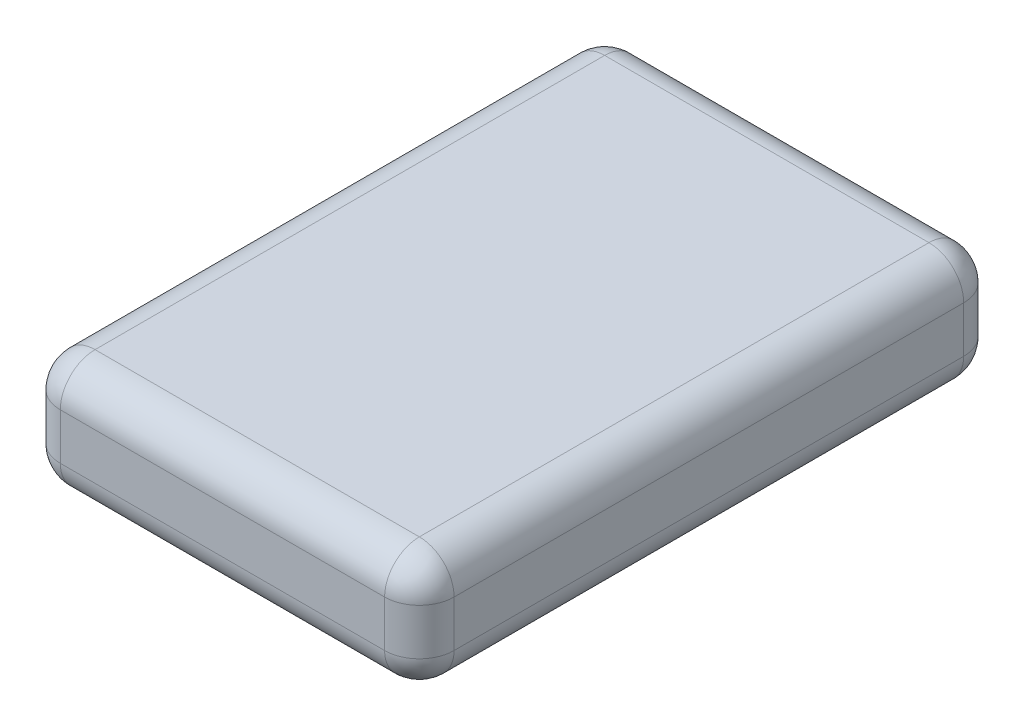
ISO-10303-21;
HEADER;
FILE_DESCRIPTION(('STEP AP214'),'2;1');
FILE_NAME('part.step','',(''),(''),'','','');
FILE_SCHEMA(('AUTOMOTIVE_DESIGN { 1 0 10303 214 1 1 1 1 }'));
ENDSEC;
DATA;
#1=APPLICATION_CONTEXT('core data for automotive mechanical design processes');
#2=APPLICATION_PROTOCOL_DEFINITION('international standard','automotive_design',2000,#1);
#3=PRODUCT_CONTEXT('',#1,'mechanical');
#4=PRODUCT('Part','Part','',(#3));
#5=PRODUCT_RELATED_PRODUCT_CATEGORY('part','',(#4));
#6=PRODUCT_DEFINITION_FORMATION('','',#4);
#7=PRODUCT_DEFINITION_CONTEXT('part definition',#1,'design');
#8=PRODUCT_DEFINITION('design','',#6,#7);
#9=PRODUCT_DEFINITION_SHAPE('','',#8);
#10=(LENGTH_UNIT() NAMED_UNIT(*) SI_UNIT(.MILLI.,.METRE.));
#11=(NAMED_UNIT(*) PLANE_ANGLE_UNIT() SI_UNIT($,.RADIAN.));
#12=(NAMED_UNIT(*) SI_UNIT($,.STERADIAN.) SOLID_ANGLE_UNIT());
#13=UNCERTAINTY_MEASURE_WITH_UNIT(LENGTH_MEASURE(1.E-05),#10,'distance_accuracy_value','');
#14=(GEOMETRIC_REPRESENTATION_CONTEXT(3) GLOBAL_UNCERTAINTY_ASSIGNED_CONTEXT((#13)) GLOBAL_UNIT_ASSIGNED_CONTEXT((#10,
#11,#12)) REPRESENTATION_CONTEXT('',''));
#15=CARTESIAN_POINT('',(0.,0.,0.));
#16=DIRECTION('',(0.,0.,1.));
#17=DIRECTION('',(1.,0.,0.));
#18=AXIS2_PLACEMENT_3D('',#15,#16,#17);
#19=CARTESIAN_POINT('',(17.,10.,-25.));
#20=DIRECTION('',(-1.,0.,0.));
#21=DIRECTION('',(0.,0.,1.));
#22=AXIS2_PLACEMENT_3D('',#19,#20,#21);
#23=PLANE('',#22);
#24=DIRECTION('',(0.,0.,-1.));
#25=VECTOR('',#24,1.);
#26=CARTESIAN_POINT('',(17.,7.,25.));
#27=LINE('',#26,#25);
#28=CARTESIAN_POINT('',(17.,7.,-22.));
#29=VERTEX_POINT('',#28);
#30=CARTESIAN_POINT('',(17.,7.,22.));
#31=VERTEX_POINT('',#30);
#32=EDGE_CURVE('E236',#29,#31,#27,.F.);
#33=ORIENTED_EDGE('',*,*,#32,.T.);
#34=DIRECTION('',(0.,-1.,0.));
#35=VECTOR('',#34,1.);
#36=CARTESIAN_POINT('',(17.,10.,22.));
#37=LINE('',#36,#35);
#38=CARTESIAN_POINT('',(17.,3.,22.));
#39=VERTEX_POINT('',#38);
#40=EDGE_CURVE('E254',#31,#39,#37,.T.);
#41=ORIENTED_EDGE('',*,*,#40,.T.);
#42=DIRECTION('',(0.,0.,-1.));
#43=VECTOR('',#42,1.);
#44=CARTESIAN_POINT('',(17.,3.,-25.));
#45=LINE('',#44,#43);
#46=CARTESIAN_POINT('',(17.,3.,-22.));
#47=VERTEX_POINT('',#46);
#48=EDGE_CURVE('E241',#39,#47,#45,.T.);
#49=ORIENTED_EDGE('',*,*,#48,.T.);
#50=DIRECTION('',(0.,-1.,0.));
#51=VECTOR('',#50,1.);
#52=CARTESIAN_POINT('',(17.,10.,-22.));
#53=LINE('',#52,#51);
#54=EDGE_CURVE('E247',#47,#29,#53,.F.);
#55=ORIENTED_EDGE('',*,*,#54,.T.);
#56=EDGE_LOOP('',(#33,#41,#49,#55));
#57=FACE_BOUND('',#56,.T.);
#58=ADVANCED_FACE('F37',(#57),#23,.F.);
#59=CARTESIAN_POINT('',(-17.,10.,-25.));
#60=DIRECTION('',(0.,0.,1.));
#61=DIRECTION('',(1.,0.,0.));
#62=AXIS2_PLACEMENT_3D('',#59,#60,#61);
#63=PLANE('',#62);
#64=DIRECTION('',(-1.,0.,0.));
#65=VECTOR('',#64,1.);
#66=CARTESIAN_POINT('',(14.,7.,-25.));
#67=LINE('',#66,#65);
#68=CARTESIAN_POINT('',(-14.,7.,-25.));
#69=VERTEX_POINT('',#68);
#70=CARTESIAN_POINT('',(14.,7.,-25.));
#71=VERTEX_POINT('',#70);
#72=EDGE_CURVE('E218',#69,#71,#67,.F.);
#73=ORIENTED_EDGE('',*,*,#72,.T.);
#74=DIRECTION('',(0.,-1.,0.));
#75=VECTOR('',#74,1.);
#76=CARTESIAN_POINT('',(14.,10.,-25.));
#77=LINE('',#76,#75);
#78=CARTESIAN_POINT('',(14.,3.,-25.));
#79=VERTEX_POINT('',#78);
#80=EDGE_CURVE('E220',#71,#79,#77,.T.);
#81=ORIENTED_EDGE('',*,*,#80,.T.);
#82=DIRECTION('',(-1.,0.,0.));
#83=VECTOR('',#82,1.);
#84=CARTESIAN_POINT('',(-17.,3.,-25.));
#85=LINE('',#84,#83);
#86=CARTESIAN_POINT('',(-14.,3.,-25.));
#87=VERTEX_POINT('',#86);
#88=EDGE_CURVE('E62',#79,#87,#85,.T.);
#89=ORIENTED_EDGE('',*,*,#88,.T.);
#90=DIRECTION('',(0.,-1.,0.));
#91=VECTOR('',#90,1.);
#92=CARTESIAN_POINT('',(-14.,10.,-25.));
#93=LINE('',#92,#91);
#94=EDGE_CURVE('E215',#87,#69,#93,.F.);
#95=ORIENTED_EDGE('',*,*,#94,.T.);
#96=EDGE_LOOP('',(#73,#81,#89,#95));
#97=FACE_BOUND('',#96,.T.);
#98=ADVANCED_FACE('F244',(#97),#63,.F.);
#99=CARTESIAN_POINT('',(-17.,10.,-25.));
#100=DIRECTION('',(1.,0.,0.));
#101=DIRECTION('',(0.,0.,-1.));
#102=AXIS2_PLACEMENT_3D('',#99,#100,#101);
#103=PLANE('',#102);
#104=DIRECTION('',(0.,0.,1.));
#105=VECTOR('',#104,1.);
#106=CARTESIAN_POINT('',(-17.,3.,-25.));
#107=LINE('',#106,#105);
#108=CARTESIAN_POINT('',(-17.,3.,-22.));
#109=VERTEX_POINT('',#108);
#110=CARTESIAN_POINT('',(-17.,3.,22.));
#111=VERTEX_POINT('',#110);
#112=EDGE_CURVE('E137',#109,#111,#107,.T.);
#113=ORIENTED_EDGE('',*,*,#112,.T.);
#114=DIRECTION('',(0.,-1.,0.));
#115=VECTOR('',#114,1.);
#116=CARTESIAN_POINT('',(-17.,10.,22.));
#117=LINE('',#116,#115);
#118=CARTESIAN_POINT('',(-17.,7.,22.));
#119=VERTEX_POINT('',#118);
#120=EDGE_CURVE('E131',#111,#119,#117,.F.);
#121=ORIENTED_EDGE('',*,*,#120,.T.);
#122=DIRECTION('',(0.,0.,1.));
#123=VECTOR('',#122,1.);
#124=CARTESIAN_POINT('',(-17.,7.,-25.));
#125=LINE('',#124,#123);
#126=CARTESIAN_POINT('',(-17.,7.,-22.));
#127=VERTEX_POINT('',#126);
#128=EDGE_CURVE('E134',#119,#127,#125,.F.);
#129=ORIENTED_EDGE('',*,*,#128,.T.);
#130=DIRECTION('',(0.,-1.,0.));
#131=VECTOR('',#130,1.);
#132=CARTESIAN_POINT('',(-17.,10.,-22.));
#133=LINE('',#132,#131);
#134=EDGE_CURVE('E142',#127,#109,#133,.T.);
#135=ORIENTED_EDGE('',*,*,#134,.T.);
#136=EDGE_LOOP('',(#113,#121,#129,#135));
#137=FACE_BOUND('',#136,.T.);
#138=ADVANCED_FACE('F133',(#137),#103,.F.);
#139=CARTESIAN_POINT('',(-17.,10.,25.));
#140=DIRECTION('',(0.,0.,-1.));
#141=DIRECTION('',(-1.,0.,0.));
#142=AXIS2_PLACEMENT_3D('',#139,#140,#141);
#143=PLANE('',#142);
#144=DIRECTION('',(1.,0.,0.));
#145=VECTOR('',#144,1.);
#146=CARTESIAN_POINT('',(-14.,7.,25.));
#147=LINE('',#146,#145);
#148=CARTESIAN_POINT('',(14.,7.,25.));
#149=VERTEX_POINT('',#148);
#150=CARTESIAN_POINT('',(-14.,7.,25.));
#151=VERTEX_POINT('',#150);
#152=EDGE_CURVE('E162',#149,#151,#147,.F.);
#153=ORIENTED_EDGE('',*,*,#152,.T.);
#154=DIRECTION('',(0.,-1.,0.));
#155=VECTOR('',#154,1.);
#156=CARTESIAN_POINT('',(-14.,10.,25.));
#157=LINE('',#156,#155);
#158=CARTESIAN_POINT('',(-14.,3.,25.));
#159=VERTEX_POINT('',#158);
#160=EDGE_CURVE('E167',#151,#159,#157,.T.);
#161=ORIENTED_EDGE('',*,*,#160,.T.);
#162=DIRECTION('',(1.,0.,0.));
#163=VECTOR('',#162,1.);
#164=CARTESIAN_POINT('',(-17.,3.,25.));
#165=LINE('',#164,#163);
#166=CARTESIAN_POINT('',(14.,3.,25.));
#167=VERTEX_POINT('',#166);
#168=EDGE_CURVE('E271',#159,#167,#165,.T.);
#169=ORIENTED_EDGE('',*,*,#168,.T.);
#170=DIRECTION('',(0.,-1.,0.));
#171=VECTOR('',#170,1.);
#172=CARTESIAN_POINT('',(14.,10.,25.));
#173=LINE('',#172,#171);
#174=EDGE_CURVE('E273',#167,#149,#173,.F.);
#175=ORIENTED_EDGE('',*,*,#174,.T.);
#176=EDGE_LOOP('',(#153,#161,#169,#175));
#177=FACE_BOUND('',#176,.T.);
#178=ADVANCED_FACE('F327',(#177),#143,.F.);
#179=CARTESIAN_POINT('',(0.,10.,0.));
#180=DIRECTION('',(0.,1.,0.));
#181=DIRECTION('',(0.,0.,1.));
#182=AXIS2_PLACEMENT_3D('',#179,#180,#181);
#183=PLANE('',#182);
#184=DIRECTION('',(0.,0.,1.));
#185=VECTOR('',#184,1.);
#186=CARTESIAN_POINT('',(-14.,10.,25.));
#187=LINE('',#186,#185);
#188=CARTESIAN_POINT('',(-14.,10.,-22.));
#189=VERTEX_POINT('',#188);
#190=CARTESIAN_POINT('',(-14.,10.,22.));
#191=VERTEX_POINT('',#190);
#192=EDGE_CURVE('E230',#189,#191,#187,.T.);
#193=ORIENTED_EDGE('',*,*,#192,.T.);
#194=DIRECTION('',(1.,0.,0.));
#195=VECTOR('',#194,1.);
#196=CARTESIAN_POINT('',(14.,10.,22.));
#197=LINE('',#196,#195);
#198=CARTESIAN_POINT('',(14.,10.,22.));
#199=VERTEX_POINT('',#198);
#200=EDGE_CURVE('E11',#191,#199,#197,.T.);
#201=ORIENTED_EDGE('',*,*,#200,.T.);
#202=DIRECTION('',(0.,0.,-1.));
#203=VECTOR('',#202,1.);
#204=CARTESIAN_POINT('',(14.,10.,-25.));
#205=LINE('',#204,#203);
#206=CARTESIAN_POINT('',(14.,10.,-22.));
#207=VERTEX_POINT('',#206);
#208=EDGE_CURVE('E232',#199,#207,#205,.T.);
#209=ORIENTED_EDGE('',*,*,#208,.T.);
#210=DIRECTION('',(-1.,0.,0.));
#211=VECTOR('',#210,1.);
#212=CARTESIAN_POINT('',(-14.,10.,-22.));
#213=LINE('',#212,#211);
#214=EDGE_CURVE('E46',#207,#189,#213,.T.);
#215=ORIENTED_EDGE('',*,*,#214,.T.);
#216=EDGE_LOOP('',(#193,#201,#209,#215));
#217=FACE_BOUND('',#216,.T.);
#218=ADVANCED_FACE('F229',(#217),#183,.T.);
#219=CARTESIAN_POINT('',(0.,0.,0.));
#220=DIRECTION('',(0.,1.,0.));
#221=DIRECTION('',(0.,0.,1.));
#222=AXIS2_PLACEMENT_3D('',#219,#220,#221);
#223=PLANE('',#222);
#224=DIRECTION('',(0.,0.,-1.));
#225=VECTOR('',#224,1.);
#226=CARTESIAN_POINT('',(14.,0.,0.));
#227=LINE('',#226,#225);
#228=CARTESIAN_POINT('',(14.,0.,-22.));
#229=VERTEX_POINT('',#228);
#230=CARTESIAN_POINT('',(14.,0.,22.));
#231=VERTEX_POINT('',#230);
#232=EDGE_CURVE('E284',#229,#231,#227,.F.);
#233=ORIENTED_EDGE('',*,*,#232,.T.);
#234=DIRECTION('',(1.,0.,0.));
#235=VECTOR('',#234,1.);
#236=CARTESIAN_POINT('',(0.,0.,22.));
#237=LINE('',#236,#235);
#238=CARTESIAN_POINT('',(-14.,0.,22.));
#239=VERTEX_POINT('',#238);
#240=EDGE_CURVE('E263',#231,#239,#237,.F.);
#241=ORIENTED_EDGE('',*,*,#240,.T.);
#242=DIRECTION('',(0.,0.,1.));
#243=VECTOR('',#242,1.);
#244=CARTESIAN_POINT('',(-14.,0.,0.));
#245=LINE('',#244,#243);
#246=CARTESIAN_POINT('',(-14.,0.,-22.));
#247=VERTEX_POINT('',#246);
#248=EDGE_CURVE('E281',#239,#247,#245,.F.);
#249=ORIENTED_EDGE('',*,*,#248,.T.);
#250=DIRECTION('',(-1.,0.,0.));
#251=VECTOR('',#250,1.);
#252=CARTESIAN_POINT('',(0.,0.,-22.));
#253=LINE('',#252,#251);
#254=EDGE_CURVE('E209',#247,#229,#253,.F.);
#255=ORIENTED_EDGE('',*,*,#254,.T.);
#256=EDGE_LOOP('',(#233,#241,#249,#255));
#257=FACE_BOUND('',#256,.T.);
#258=ADVANCED_FACE('F290',(#257),#223,.F.);
#259=CARTESIAN_POINT('',(-14.,3.,-25.));
#260=DIRECTION('',(0.,0.,1.));
#261=DIRECTION('',(1.,0.,0.));
#262=AXIS2_PLACEMENT_3D('',#259,#260,#261);
#263=CYLINDRICAL_SURFACE('',#262,3.);
#264=ORIENTED_EDGE('',*,*,#248,.F.);
#265=CARTESIAN_POINT('',(-14.,3.,22.));
#266=DIRECTION('',(0.,0.,1.));
#267=DIRECTION('',(1.,0.,0.));
#268=AXIS2_PLACEMENT_3D('',#265,#266,#267);
#269=CIRCLE('',#268,3.);
#270=EDGE_CURVE('E266',#239,#111,#269,.F.);
#271=ORIENTED_EDGE('',*,*,#270,.T.);
#272=ORIENTED_EDGE('',*,*,#112,.F.);
#273=CARTESIAN_POINT('',(-14.,3.,-22.));
#274=DIRECTION('',(0.,0.,1.));
#275=DIRECTION('',(1.,0.,0.));
#276=AXIS2_PLACEMENT_3D('',#273,#274,#275);
#277=CIRCLE('',#276,3.);
#278=EDGE_CURVE('E141',#109,#247,#277,.T.);
#279=ORIENTED_EDGE('',*,*,#278,.T.);
#280=EDGE_LOOP('',(#264,#271,#272,#279));
#281=FACE_BOUND('',#280,.T.);
#282=ADVANCED_FACE('F307',(#281),#263,.T.);
#283=CARTESIAN_POINT('',(-14.,7.,0.));
#284=DIRECTION('',(0.,0.,-1.));
#285=DIRECTION('',(-1.,0.,0.));
#286=AXIS2_PLACEMENT_3D('',#283,#284,#285);
#287=CYLINDRICAL_SURFACE('',#286,3.);
#288=ORIENTED_EDGE('',*,*,#128,.F.);
#289=CARTESIAN_POINT('',(-14.,7.,22.));
#290=DIRECTION('',(0.,0.,-1.));
#291=DIRECTION('',(-1.,0.,0.));
#292=AXIS2_PLACEMENT_3D('',#289,#290,#291);
#293=CIRCLE('',#292,3.);
#294=EDGE_CURVE('E149',#119,#191,#293,.T.);
#295=ORIENTED_EDGE('',*,*,#294,.T.);
#296=ORIENTED_EDGE('',*,*,#192,.F.);
#297=CARTESIAN_POINT('',(-14.,7.,-22.));
#298=DIRECTION('',(0.,0.,-1.));
#299=DIRECTION('',(-1.,0.,0.));
#300=AXIS2_PLACEMENT_3D('',#297,#298,#299);
#301=CIRCLE('',#300,3.);
#302=EDGE_CURVE('E152',#189,#127,#301,.F.);
#303=ORIENTED_EDGE('',*,*,#302,.T.);
#304=EDGE_LOOP('',(#288,#295,#296,#303));
#305=FACE_BOUND('',#304,.T.);
#306=ADVANCED_FACE('F147',(#305),#287,.T.);
#307=CARTESIAN_POINT('',(14.,3.,-25.));
#308=DIRECTION('',(0.,0.,-1.));
#309=DIRECTION('',(-1.,0.,0.));
#310=AXIS2_PLACEMENT_3D('',#307,#308,#309);
#311=CYLINDRICAL_SURFACE('',#310,3.);
#312=ORIENTED_EDGE('',*,*,#48,.F.);
#313=CARTESIAN_POINT('',(14.,3.,22.));
#314=DIRECTION('',(0.,0.,-1.));
#315=DIRECTION('',(-1.,0.,0.));
#316=AXIS2_PLACEMENT_3D('',#313,#314,#315);
#317=CIRCLE('',#316,3.);
#318=EDGE_CURVE('E259',#39,#231,#317,.T.);
#319=ORIENTED_EDGE('',*,*,#318,.T.);
#320=ORIENTED_EDGE('',*,*,#232,.F.);
#321=CARTESIAN_POINT('',(14.,3.,-22.));
#322=DIRECTION('',(0.,0.,-1.));
#323=DIRECTION('',(-1.,0.,0.));
#324=AXIS2_PLACEMENT_3D('',#321,#322,#323);
#325=CIRCLE('',#324,3.);
#326=EDGE_CURVE('E261',#229,#47,#325,.F.);
#327=ORIENTED_EDGE('',*,*,#326,.T.);
#328=EDGE_LOOP('',(#312,#319,#320,#327));
#329=FACE_BOUND('',#328,.T.);
#330=ADVANCED_FACE('F314',(#329),#311,.T.);
#331=CARTESIAN_POINT('',(14.,7.,0.));
#332=DIRECTION('',(0.,0.,1.));
#333=DIRECTION('',(1.,0.,0.));
#334=AXIS2_PLACEMENT_3D('',#331,#332,#333);
#335=CYLINDRICAL_SURFACE('',#334,3.);
#336=ORIENTED_EDGE('',*,*,#208,.F.);
#337=CARTESIAN_POINT('',(14.,7.,22.));
#338=DIRECTION('',(0.,0.,1.));
#339=DIRECTION('',(1.,0.,0.));
#340=AXIS2_PLACEMENT_3D('',#337,#338,#339);
#341=CIRCLE('',#340,3.);
#342=EDGE_CURVE('E222',#199,#31,#341,.F.);
#343=ORIENTED_EDGE('',*,*,#342,.T.);
#344=ORIENTED_EDGE('',*,*,#32,.F.);
#345=CARTESIAN_POINT('',(14.,7.,-22.));
#346=DIRECTION('',(0.,0.,1.));
#347=DIRECTION('',(1.,0.,0.));
#348=AXIS2_PLACEMENT_3D('',#345,#346,#347);
#349=CIRCLE('',#348,3.);
#350=EDGE_CURVE('E251',#29,#207,#349,.T.);
#351=ORIENTED_EDGE('',*,*,#350,.T.);
#352=EDGE_LOOP('',(#336,#343,#344,#351));
#353=FACE_BOUND('',#352,.T.);
#354=ADVANCED_FACE('F467',(#353),#335,.T.);
#355=CARTESIAN_POINT('',(14.,3.,22.));
#356=DIRECTION('',(0.,0.,-1.));
#357=DIRECTION('',(-1.,0.,0.));
#358=AXIS2_PLACEMENT_3D('',#355,#356,#357);
#359=SPHERICAL_SURFACE('',#358,3.);
#360=CARTESIAN_POINT('',(14.,3.,22.));
#361=DIRECTION('',(-1.,0.,0.));
#362=DIRECTION('',(0.,0.,1.));
#363=AXIS2_PLACEMENT_3D('',#360,#361,#362);
#364=CIRCLE('',#363,3.);
#365=EDGE_CURVE('E185',#231,#167,#364,.T.);
#366=ORIENTED_EDGE('',*,*,#365,.F.);
#367=ORIENTED_EDGE('',*,*,#318,.F.);
#368=CARTESIAN_POINT('',(14.,3.,22.));
#369=DIRECTION('',(0.,1.,0.));
#370=DIRECTION('',(0.,0.,1.));
#371=AXIS2_PLACEMENT_3D('',#368,#369,#370);
#372=CIRCLE('',#371,3.);
#373=EDGE_CURVE('E153',#167,#39,#372,.T.);
#374=ORIENTED_EDGE('',*,*,#373,.F.);
#375=EDGE_LOOP('',(#366,#367,#374));
#376=FACE_BOUND('',#375,.T.);
#377=ADVANCED_FACE('F297',(#376),#359,.T.);
#378=CARTESIAN_POINT('',(14.,10.,22.));
#379=DIRECTION('',(0.,-1.,0.));
#380=DIRECTION('',(0.,0.,-1.));
#381=AXIS2_PLACEMENT_3D('',#378,#379,#380);
#382=CYLINDRICAL_SURFACE('',#381,3.);
#383=ORIENTED_EDGE('',*,*,#373,.T.);
#384=ORIENTED_EDGE('',*,*,#40,.F.);
#385=CARTESIAN_POINT('',(14.,7.,22.));
#386=DIRECTION('',(0.,1.,0.));
#387=DIRECTION('',(0.,0.,1.));
#388=AXIS2_PLACEMENT_3D('',#385,#386,#387);
#389=CIRCLE('',#388,3.);
#390=EDGE_CURVE('E182',#149,#31,#389,.T.);
#391=ORIENTED_EDGE('',*,*,#390,.F.);
#392=ORIENTED_EDGE('',*,*,#174,.F.);
#393=EDGE_LOOP('',(#383,#384,#391,#392));
#394=FACE_BOUND('',#393,.T.);
#395=ADVANCED_FACE('F453',(#394),#382,.T.);
#396=CARTESIAN_POINT('',(-17.,3.,22.));
#397=DIRECTION('',(1.,0.,0.));
#398=DIRECTION('',(0.,0.,-1.));
#399=AXIS2_PLACEMENT_3D('',#396,#397,#398);
#400=CYLINDRICAL_SURFACE('',#399,3.);
#401=ORIENTED_EDGE('',*,*,#365,.T.);
#402=ORIENTED_EDGE('',*,*,#168,.F.);
#403=CARTESIAN_POINT('',(-14.,3.,22.));
#404=DIRECTION('',(-1.,0.,0.));
#405=DIRECTION('',(0.,0.,1.));
#406=AXIS2_PLACEMENT_3D('',#403,#404,#405);
#407=CIRCLE('',#406,3.);
#408=EDGE_CURVE('E179',#239,#159,#407,.T.);
#409=ORIENTED_EDGE('',*,*,#408,.F.);
#410=ORIENTED_EDGE('',*,*,#240,.F.);
#411=EDGE_LOOP('',(#401,#402,#409,#410));
#412=FACE_BOUND('',#411,.T.);
#413=ADVANCED_FACE('F302',(#412),#400,.T.);
#414=CARTESIAN_POINT('',(14.,7.,22.));
#415=DIRECTION('',(0.,0.,-1.));
#416=DIRECTION('',(-1.,0.,0.));
#417=AXIS2_PLACEMENT_3D('',#414,#415,#416);
#418=SPHERICAL_SURFACE('',#417,3.);
#419=ORIENTED_EDGE('',*,*,#390,.T.);
#420=ORIENTED_EDGE('',*,*,#342,.F.);
#421=CARTESIAN_POINT('',(14.,7.,22.));
#422=DIRECTION('',(-1.,0.,0.));
#423=DIRECTION('',(0.,0.,1.));
#424=AXIS2_PLACEMENT_3D('',#421,#422,#423);
#425=CIRCLE('',#424,3.);
#426=EDGE_CURVE('E176',#149,#199,#425,.T.);
#427=ORIENTED_EDGE('',*,*,#426,.F.);
#428=EDGE_LOOP('',(#419,#420,#427));
#429=FACE_BOUND('',#428,.T.);
#430=ADVANCED_FACE('F439',(#429),#418,.T.);
#431=CARTESIAN_POINT('',(-14.,3.,22.));
#432=DIRECTION('',(0.,0.,-1.));
#433=DIRECTION('',(-1.,0.,0.));
#434=AXIS2_PLACEMENT_3D('',#431,#432,#433);
#435=SPHERICAL_SURFACE('',#434,3.);
#436=ORIENTED_EDGE('',*,*,#270,.F.);
#437=ORIENTED_EDGE('',*,*,#408,.T.);
#438=CARTESIAN_POINT('',(-14.,3.,22.));
#439=DIRECTION('',(0.,1.,0.));
#440=DIRECTION('',(0.,0.,1.));
#441=AXIS2_PLACEMENT_3D('',#438,#439,#440);
#442=CIRCLE('',#441,3.);
#443=EDGE_CURVE('E169',#111,#159,#442,.T.);
#444=ORIENTED_EDGE('',*,*,#443,.F.);
#445=EDGE_LOOP('',(#436,#437,#444));
#446=FACE_BOUND('',#445,.T.);
#447=ADVANCED_FACE('F305',(#446),#435,.T.);
#448=CARTESIAN_POINT('',(0.,7.,22.));
#449=DIRECTION('',(-1.,0.,0.));
#450=DIRECTION('',(0.,0.,1.));
#451=AXIS2_PLACEMENT_3D('',#448,#449,#450);
#452=CYLINDRICAL_SURFACE('',#451,3.);
#453=ORIENTED_EDGE('',*,*,#426,.T.);
#454=ORIENTED_EDGE('',*,*,#200,.F.);
#455=CARTESIAN_POINT('',(-14.,7.,22.));
#456=DIRECTION('',(-1.,0.,0.));
#457=DIRECTION('',(0.,0.,1.));
#458=AXIS2_PLACEMENT_3D('',#455,#456,#457);
#459=CIRCLE('',#458,3.);
#460=EDGE_CURVE('E160',#151,#191,#459,.T.);
#461=ORIENTED_EDGE('',*,*,#460,.F.);
#462=ORIENTED_EDGE('',*,*,#152,.F.);
#463=EDGE_LOOP('',(#453,#454,#461,#462));
#464=FACE_BOUND('',#463,.T.);
#465=ADVANCED_FACE('F425',(#464),#452,.T.);
#466=CARTESIAN_POINT('',(-14.,10.,22.));
#467=DIRECTION('',(0.,-1.,0.));
#468=DIRECTION('',(0.,0.,-1.));
#469=AXIS2_PLACEMENT_3D('',#466,#467,#468);
#470=CYLINDRICAL_SURFACE('',#469,3.);
#471=ORIENTED_EDGE('',*,*,#443,.T.);
#472=ORIENTED_EDGE('',*,*,#160,.F.);
#473=CARTESIAN_POINT('',(-14.,7.,22.));
#474=DIRECTION('',(0.,1.,0.));
#475=DIRECTION('',(0.,0.,1.));
#476=AXIS2_PLACEMENT_3D('',#473,#474,#475);
#477=CIRCLE('',#476,3.);
#478=EDGE_CURVE('E158',#119,#151,#477,.T.);
#479=ORIENTED_EDGE('',*,*,#478,.F.);
#480=ORIENTED_EDGE('',*,*,#120,.F.);
#481=EDGE_LOOP('',(#471,#472,#479,#480));
#482=FACE_BOUND('',#481,.T.);
#483=ADVANCED_FACE('F165',(#482),#470,.T.);
#484=CARTESIAN_POINT('',(-14.,7.,22.));
#485=DIRECTION('',(0.,0.,-1.));
#486=DIRECTION('',(-1.,0.,0.));
#487=AXIS2_PLACEMENT_3D('',#484,#485,#486);
#488=SPHERICAL_SURFACE('',#487,3.);
#489=ORIENTED_EDGE('',*,*,#460,.T.);
#490=ORIENTED_EDGE('',*,*,#294,.F.);
#491=ORIENTED_EDGE('',*,*,#478,.T.);
#492=EDGE_LOOP('',(#489,#490,#491));
#493=FACE_BOUND('',#492,.T.);
#494=ADVANCED_FACE('F157',(#493),#488,.T.);
#495=CARTESIAN_POINT('',(-14.,3.,-22.));
#496=DIRECTION('',(0.,0.,1.));
#497=DIRECTION('',(1.,0.,0.));
#498=AXIS2_PLACEMENT_3D('',#495,#496,#497);
#499=SPHERICAL_SURFACE('',#498,3.);
#500=CARTESIAN_POINT('',(-14.,3.,-22.));
#501=DIRECTION('',(1.,0.,0.));
#502=DIRECTION('',(0.,0.,-1.));
#503=AXIS2_PLACEMENT_3D('',#500,#501,#502);
#504=CIRCLE('',#503,3.);
#505=EDGE_CURVE('E172',#247,#87,#504,.T.);
#506=ORIENTED_EDGE('',*,*,#505,.F.);
#507=ORIENTED_EDGE('',*,*,#278,.F.);
#508=CARTESIAN_POINT('',(-14.,3.,-22.));
#509=DIRECTION('',(0.,1.,0.));
#510=DIRECTION('',(0.,0.,1.));
#511=AXIS2_PLACEMENT_3D('',#508,#509,#510);
#512=CIRCLE('',#511,3.);
#513=EDGE_CURVE('E41',#87,#109,#512,.T.);
#514=ORIENTED_EDGE('',*,*,#513,.F.);
#515=EDGE_LOOP('',(#506,#507,#514));
#516=FACE_BOUND('',#515,.T.);
#517=ADVANCED_FACE('F39',(#516),#499,.T.);
#518=CARTESIAN_POINT('',(-14.,10.,-22.));
#519=DIRECTION('',(0.,-1.,0.));
#520=DIRECTION('',(0.,0.,-1.));
#521=AXIS2_PLACEMENT_3D('',#518,#519,#520);
#522=CYLINDRICAL_SURFACE('',#521,3.);
#523=ORIENTED_EDGE('',*,*,#513,.T.);
#524=ORIENTED_EDGE('',*,*,#134,.F.);
#525=CARTESIAN_POINT('',(-14.,7.,-22.));
#526=DIRECTION('',(0.,1.,0.));
#527=DIRECTION('',(0.,0.,1.));
#528=AXIS2_PLACEMENT_3D('',#525,#526,#527);
#529=CIRCLE('',#528,3.);
#530=EDGE_CURVE('E201',#69,#127,#529,.T.);
#531=ORIENTED_EDGE('',*,*,#530,.F.);
#532=ORIENTED_EDGE('',*,*,#94,.F.);
#533=EDGE_LOOP('',(#523,#524,#531,#532));
#534=FACE_BOUND('',#533,.T.);
#535=ADVANCED_FACE('F216',(#534),#522,.T.);
#536=CARTESIAN_POINT('',(-17.,3.,-22.));
#537=DIRECTION('',(-1.,0.,0.));
#538=DIRECTION('',(0.,0.,1.));
#539=AXIS2_PLACEMENT_3D('',#536,#537,#538);
#540=CYLINDRICAL_SURFACE('',#539,3.);
#541=ORIENTED_EDGE('',*,*,#505,.T.);
#542=ORIENTED_EDGE('',*,*,#88,.F.);
#543=CARTESIAN_POINT('',(14.,3.,-22.));
#544=DIRECTION('',(1.,0.,0.));
#545=DIRECTION('',(0.,0.,-1.));
#546=AXIS2_PLACEMENT_3D('',#543,#544,#545);
#547=CIRCLE('',#546,3.);
#548=EDGE_CURVE('E199',#229,#79,#547,.T.);
#549=ORIENTED_EDGE('',*,*,#548,.F.);
#550=ORIENTED_EDGE('',*,*,#254,.F.);
#551=EDGE_LOOP('',(#541,#542,#549,#550));
#552=FACE_BOUND('',#551,.T.);
#553=ADVANCED_FACE('F207',(#552),#540,.T.);
#554=CARTESIAN_POINT('',(-14.,7.,-22.));
#555=DIRECTION('',(0.,0.,1.));
#556=DIRECTION('',(1.,0.,0.));
#557=AXIS2_PLACEMENT_3D('',#554,#555,#556);
#558=SPHERICAL_SURFACE('',#557,3.);
#559=ORIENTED_EDGE('',*,*,#530,.T.);
#560=ORIENTED_EDGE('',*,*,#302,.F.);
#561=CARTESIAN_POINT('',(-14.,7.,-22.));
#562=DIRECTION('',(1.,0.,0.));
#563=DIRECTION('',(0.,0.,-1.));
#564=AXIS2_PLACEMENT_3D('',#561,#562,#563);
#565=CIRCLE('',#564,3.);
#566=EDGE_CURVE('E196',#69,#189,#565,.T.);
#567=ORIENTED_EDGE('',*,*,#566,.F.);
#568=EDGE_LOOP('',(#559,#560,#567));
#569=FACE_BOUND('',#568,.T.);
#570=ADVANCED_FACE('F239',(#569),#558,.T.);
#571=CARTESIAN_POINT('',(14.,3.,-22.));
#572=DIRECTION('',(0.,0.,1.));
#573=DIRECTION('',(1.,0.,0.));
#574=AXIS2_PLACEMENT_3D('',#571,#572,#573);
#575=SPHERICAL_SURFACE('',#574,3.);
#576=ORIENTED_EDGE('',*,*,#326,.F.);
#577=ORIENTED_EDGE('',*,*,#548,.T.);
#578=CARTESIAN_POINT('',(14.,3.,-22.));
#579=DIRECTION('',(0.,1.,0.));
#580=DIRECTION('',(0.,0.,1.));
#581=AXIS2_PLACEMENT_3D('',#578,#579,#580);
#582=CIRCLE('',#581,3.);
#583=EDGE_CURVE('E54',#47,#79,#582,.T.);
#584=ORIENTED_EDGE('',*,*,#583,.F.);
#585=EDGE_LOOP('',(#576,#577,#584));
#586=FACE_BOUND('',#585,.T.);
#587=ADVANCED_FACE('F356',(#586),#575,.T.);
#588=CARTESIAN_POINT('',(0.,7.,-22.));
#589=DIRECTION('',(1.,0.,0.));
#590=DIRECTION('',(0.,0.,-1.));
#591=AXIS2_PLACEMENT_3D('',#588,#589,#590);
#592=CYLINDRICAL_SURFACE('',#591,3.);
#593=ORIENTED_EDGE('',*,*,#566,.T.);
#594=ORIENTED_EDGE('',*,*,#214,.F.);
#595=CARTESIAN_POINT('',(14.,7.,-22.));
#596=DIRECTION('',(1.,0.,0.));
#597=DIRECTION('',(0.,0.,-1.));
#598=AXIS2_PLACEMENT_3D('',#595,#596,#597);
#599=CIRCLE('',#598,3.);
#600=EDGE_CURVE('E193',#71,#207,#599,.T.);
#601=ORIENTED_EDGE('',*,*,#600,.F.);
#602=ORIENTED_EDGE('',*,*,#72,.F.);
#603=EDGE_LOOP('',(#593,#594,#601,#602));
#604=FACE_BOUND('',#603,.T.);
#605=ADVANCED_FACE('F243',(#604),#592,.T.);
#606=CARTESIAN_POINT('',(14.,10.,-22.));
#607=DIRECTION('',(0.,-1.,0.));
#608=DIRECTION('',(0.,0.,-1.));
#609=AXIS2_PLACEMENT_3D('',#606,#607,#608);
#610=CYLINDRICAL_SURFACE('',#609,3.);
#611=ORIENTED_EDGE('',*,*,#583,.T.);
#612=ORIENTED_EDGE('',*,*,#80,.F.);
#613=CARTESIAN_POINT('',(14.,7.,-22.));
#614=DIRECTION('',(0.,1.,0.));
#615=DIRECTION('',(0.,0.,1.));
#616=AXIS2_PLACEMENT_3D('',#613,#614,#615);
#617=CIRCLE('',#616,3.);
#618=EDGE_CURVE('E190',#29,#71,#617,.T.);
#619=ORIENTED_EDGE('',*,*,#618,.F.);
#620=ORIENTED_EDGE('',*,*,#54,.F.);
#621=EDGE_LOOP('',(#611,#612,#619,#620));
#622=FACE_BOUND('',#621,.T.);
#623=ADVANCED_FACE('F246',(#622),#610,.T.);
#624=CARTESIAN_POINT('',(14.,7.,-22.));
#625=DIRECTION('',(0.,0.,1.));
#626=DIRECTION('',(1.,0.,0.));
#627=AXIS2_PLACEMENT_3D('',#624,#625,#626);
#628=SPHERICAL_SURFACE('',#627,3.);
#629=ORIENTED_EDGE('',*,*,#600,.T.);
#630=ORIENTED_EDGE('',*,*,#350,.F.);
#631=ORIENTED_EDGE('',*,*,#618,.T.);
#632=EDGE_LOOP('',(#629,#630,#631));
#633=FACE_BOUND('',#632,.T.);
#634=ADVANCED_FACE('F250',(#633),#628,.T.);
#635=CLOSED_SHELL('',(#58,#98,#138,#178,#218,#258,#282,#306,#330,#354,#377,#395,#413,#430,#447,
#465,#483,#494,#517,#535,#553,#570,#587,#605,#623,#634));
#636=MANIFOLD_SOLID_BREP('B2',#635);
#637=ADVANCED_BREP_SHAPE_REPRESENTATION('',(#18,#636),#14);
#638=SHAPE_DEFINITION_REPRESENTATION(#9,#637);
ENDSEC;
END-ISO-10303-21;
